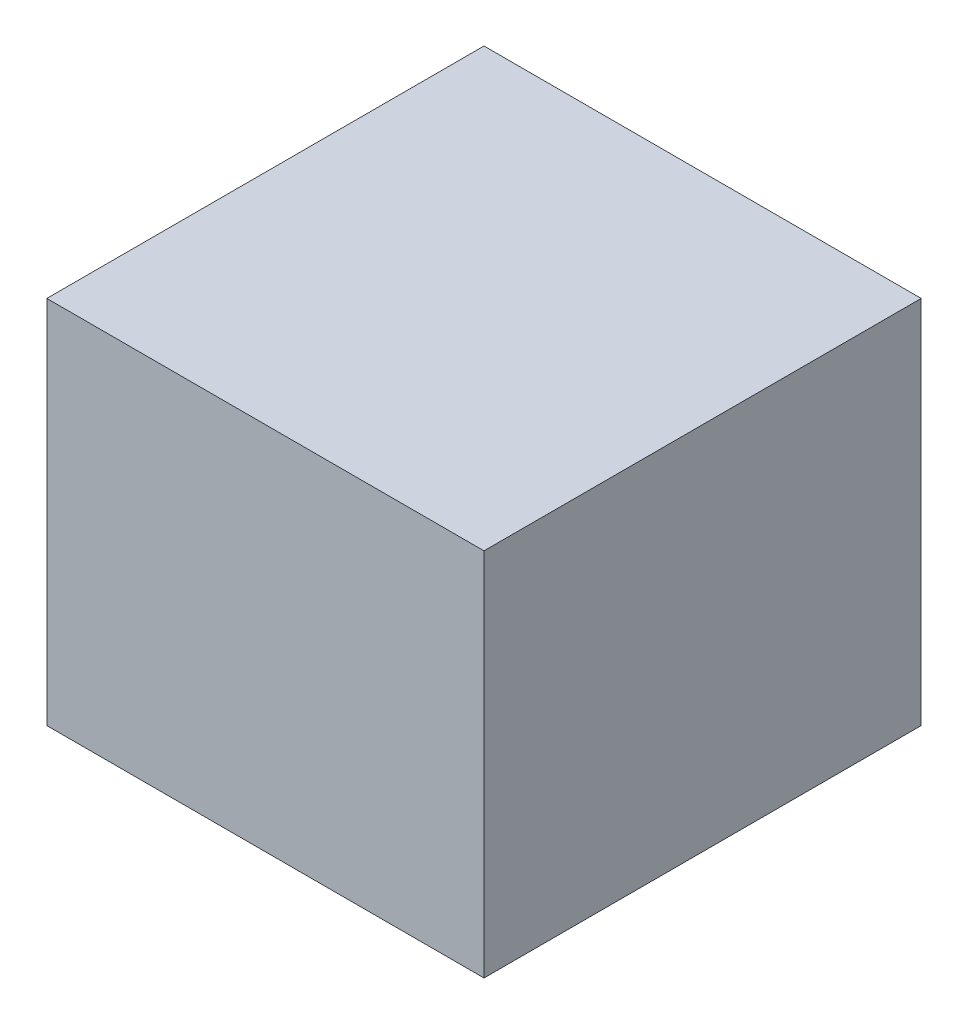
ISO-10303-21;
HEADER;
FILE_DESCRIPTION(('STEP AP214'),'2;1');
FILE_NAME('part.step','',(''),(''),'','','');
FILE_SCHEMA(('AUTOMOTIVE_DESIGN { 1 0 10303 214 1 1 1 1 }'));
ENDSEC;
DATA;
#1=APPLICATION_CONTEXT('core data for automotive mechanical design processes');
#2=APPLICATION_PROTOCOL_DEFINITION('international standard','automotive_design',2000,#1);
#3=PRODUCT_CONTEXT('',#1,'mechanical');
#4=PRODUCT('Part','Part','',(#3));
#5=PRODUCT_RELATED_PRODUCT_CATEGORY('part','',(#4));
#6=PRODUCT_DEFINITION_FORMATION('','',#4);
#7=PRODUCT_DEFINITION_CONTEXT('part definition',#1,'design');
#8=PRODUCT_DEFINITION('design','',#6,#7);
#9=PRODUCT_DEFINITION_SHAPE('','',#8);
#10=(LENGTH_UNIT() NAMED_UNIT(*) SI_UNIT(.MILLI.,.METRE.));
#11=(NAMED_UNIT(*) PLANE_ANGLE_UNIT() SI_UNIT($,.RADIAN.));
#12=(NAMED_UNIT(*) SI_UNIT($,.STERADIAN.) SOLID_ANGLE_UNIT());
#13=UNCERTAINTY_MEASURE_WITH_UNIT(LENGTH_MEASURE(1.E-05),#10,'distance_accuracy_value','');
#14=(GEOMETRIC_REPRESENTATION_CONTEXT(3) GLOBAL_UNCERTAINTY_ASSIGNED_CONTEXT((#13)) GLOBAL_UNIT_ASSIGNED_CONTEXT((#10,
#11,#12)) REPRESENTATION_CONTEXT('',''));
#15=CARTESIAN_POINT('',(0.,0.,0.));
#16=DIRECTION('',(0.,0.,1.));
#17=DIRECTION('',(1.,0.,0.));
#18=AXIS2_PLACEMENT_3D('',#15,#16,#17);
#19=CARTESIAN_POINT('',(165.1,279.4,165.1));
#20=DIRECTION('',(-1.,0.,0.));
#21=DIRECTION('',(0.,0.,1.));
#22=AXIS2_PLACEMENT_3D('',#19,#20,#21);
#23=PLANE('',#22);
#24=DIRECTION('',(0.,0.,-1.));
#25=VECTOR('',#24,1.);
#26=CARTESIAN_POINT('',(165.1,0.,165.1));
#27=LINE('',#26,#25);
#28=CARTESIAN_POINT('',(165.1,0.,165.1));
#29=VERTEX_POINT('',#28);
#30=CARTESIAN_POINT('',(165.1,0.,-165.1));
#31=VERTEX_POINT('',#30);
#32=EDGE_CURVE('E96',#29,#31,#27,.T.);
#33=ORIENTED_EDGE('',*,*,#32,.T.);
#34=DIRECTION('',(0.,-1.,0.));
#35=VECTOR('',#34,1.);
#36=CARTESIAN_POINT('',(165.1,279.4,-165.1));
#37=LINE('',#36,#35);
#38=CARTESIAN_POINT('',(165.1,279.4,-165.1));
#39=VERTEX_POINT('',#38);
#40=EDGE_CURVE('E11',#39,#31,#37,.T.);
#41=ORIENTED_EDGE('',*,*,#40,.F.);
#42=DIRECTION('',(0.,0.,-1.));
#43=VECTOR('',#42,1.);
#44=CARTESIAN_POINT('',(165.1,279.4,165.1));
#45=LINE('',#44,#43);
#46=CARTESIAN_POINT('',(165.1,279.4,165.1));
#47=VERTEX_POINT('',#46);
#48=EDGE_CURVE('E84',#47,#39,#45,.T.);
#49=ORIENTED_EDGE('',*,*,#48,.F.);
#50=DIRECTION('',(0.,-1.,0.));
#51=VECTOR('',#50,1.);
#52=CARTESIAN_POINT('',(165.1,279.4,165.1));
#53=LINE('',#52,#51);
#54=EDGE_CURVE('E92',#47,#29,#53,.T.);
#55=ORIENTED_EDGE('',*,*,#54,.T.);
#56=EDGE_LOOP('',(#33,#41,#49,#55));
#57=FACE_BOUND('',#56,.T.);
#58=ADVANCED_FACE('F33',(#57),#23,.F.);
#59=CARTESIAN_POINT('',(-165.1,279.4,-165.1));
#60=DIRECTION('',(0.,0.,1.));
#61=DIRECTION('',(1.,0.,0.));
#62=AXIS2_PLACEMENT_3D('',#59,#60,#61);
#63=PLANE('',#62);
#64=DIRECTION('',(-1.,0.,0.));
#65=VECTOR('',#64,1.);
#66=CARTESIAN_POINT('',(-165.1,0.,-165.1));
#67=LINE('',#66,#65);
#68=CARTESIAN_POINT('',(-165.1,0.,-165.1));
#69=VERTEX_POINT('',#68);
#70=EDGE_CURVE('E88',#31,#69,#67,.T.);
#71=ORIENTED_EDGE('',*,*,#70,.T.);
#72=DIRECTION('',(0.,-1.,0.));
#73=VECTOR('',#72,1.);
#74=CARTESIAN_POINT('',(-165.1,279.4,-165.1));
#75=LINE('',#74,#73);
#76=CARTESIAN_POINT('',(-165.1,279.4,-165.1));
#77=VERTEX_POINT('',#76);
#78=EDGE_CURVE('E41',#77,#69,#75,.T.);
#79=ORIENTED_EDGE('',*,*,#78,.F.);
#80=DIRECTION('',(-1.,0.,0.));
#81=VECTOR('',#80,1.);
#82=CARTESIAN_POINT('',(-165.1,279.4,-165.1));
#83=LINE('',#82,#81);
#84=EDGE_CURVE('E79',#39,#77,#83,.T.);
#85=ORIENTED_EDGE('',*,*,#84,.F.);
#86=ORIENTED_EDGE('',*,*,#40,.T.);
#87=EDGE_LOOP('',(#71,#79,#85,#86));
#88=FACE_BOUND('',#87,.T.);
#89=ADVANCED_FACE('F87',(#88),#63,.F.);
#90=CARTESIAN_POINT('',(-165.1,279.4,165.1));
#91=DIRECTION('',(1.,0.,0.));
#92=DIRECTION('',(0.,0.,-1.));
#93=AXIS2_PLACEMENT_3D('',#90,#91,#92);
#94=PLANE('',#93);
#95=DIRECTION('',(0.,0.,1.));
#96=VECTOR('',#95,1.);
#97=CARTESIAN_POINT('',(-165.1,0.,165.1));
#98=LINE('',#97,#96);
#99=CARTESIAN_POINT('',(-165.1,0.,165.1));
#100=VERTEX_POINT('',#99);
#101=EDGE_CURVE('E66',#69,#100,#98,.T.);
#102=ORIENTED_EDGE('',*,*,#101,.T.);
#103=DIRECTION('',(0.,-1.,0.));
#104=VECTOR('',#103,1.);
#105=CARTESIAN_POINT('',(-165.1,279.4,165.1));
#106=LINE('',#105,#104);
#107=CARTESIAN_POINT('',(-165.1,279.4,165.1));
#108=VERTEX_POINT('',#107);
#109=EDGE_CURVE('E89',#108,#100,#106,.T.);
#110=ORIENTED_EDGE('',*,*,#109,.F.);
#111=DIRECTION('',(0.,0.,1.));
#112=VECTOR('',#111,1.);
#113=CARTESIAN_POINT('',(-165.1,279.4,165.1));
#114=LINE('',#113,#112);
#115=EDGE_CURVE('E82',#77,#108,#114,.T.);
#116=ORIENTED_EDGE('',*,*,#115,.F.);
#117=ORIENTED_EDGE('',*,*,#78,.T.);
#118=EDGE_LOOP('',(#102,#110,#116,#117));
#119=FACE_BOUND('',#118,.T.);
#120=ADVANCED_FACE('F90',(#119),#94,.F.);
#121=CARTESIAN_POINT('',(-165.1,279.4,165.1));
#122=DIRECTION('',(0.,0.,-1.));
#123=DIRECTION('',(-1.,0.,0.));
#124=AXIS2_PLACEMENT_3D('',#121,#122,#123);
#125=PLANE('',#124);
#126=DIRECTION('',(1.,0.,0.));
#127=VECTOR('',#126,1.);
#128=CARTESIAN_POINT('',(-165.1,0.,165.1));
#129=LINE('',#128,#127);
#130=EDGE_CURVE('E72',#100,#29,#129,.T.);
#131=ORIENTED_EDGE('',*,*,#130,.T.);
#132=ORIENTED_EDGE('',*,*,#54,.F.);
#133=DIRECTION('',(1.,0.,0.));
#134=VECTOR('',#133,1.);
#135=CARTESIAN_POINT('',(-165.1,279.4,165.1));
#136=LINE('',#135,#134);
#137=EDGE_CURVE('E49',#108,#47,#136,.T.);
#138=ORIENTED_EDGE('',*,*,#137,.F.);
#139=ORIENTED_EDGE('',*,*,#109,.T.);
#140=EDGE_LOOP('',(#131,#132,#138,#139));
#141=FACE_BOUND('',#140,.T.);
#142=ADVANCED_FACE('F103',(#141),#125,.F.);
#143=CARTESIAN_POINT('',(0.,279.4,0.));
#144=DIRECTION('',(0.,-1.,0.));
#145=DIRECTION('',(0.,0.,-1.));
#146=AXIS2_PLACEMENT_3D('',#143,#144,#145);
#147=PLANE('',#146);
#148=ORIENTED_EDGE('',*,*,#48,.T.);
#149=ORIENTED_EDGE('',*,*,#84,.T.);
#150=ORIENTED_EDGE('',*,*,#115,.T.);
#151=ORIENTED_EDGE('',*,*,#137,.T.);
#152=EDGE_LOOP('',(#148,#149,#150,#151));
#153=FACE_BOUND('',#152,.T.);
#154=ADVANCED_FACE('F80',(#153),#147,.F.);
#155=CARTESIAN_POINT('',(0.,0.,0.));
#156=DIRECTION('',(0.,-1.,0.));
#157=DIRECTION('',(0.,0.,-1.));
#158=AXIS2_PLACEMENT_3D('',#155,#156,#157);
#159=PLANE('',#158);
#160=ORIENTED_EDGE('',*,*,#32,.F.);
#161=ORIENTED_EDGE('',*,*,#130,.F.);
#162=ORIENTED_EDGE('',*,*,#101,.F.);
#163=ORIENTED_EDGE('',*,*,#70,.F.);
#164=EDGE_LOOP('',(#160,#161,#162,#163));
#165=FACE_BOUND('',#164,.T.);
#166=ADVANCED_FACE('F106',(#165),#159,.T.);
#167=CLOSED_SHELL('',(#58,#89,#120,#142,#154,#166));
#168=MANIFOLD_SOLID_BREP('B2',#167);
#169=ADVANCED_BREP_SHAPE_REPRESENTATION('',(#18,#168),#14);
#170=SHAPE_DEFINITION_REPRESENTATION(#9,#169);
ENDSEC;
END-ISO-10303-21;
